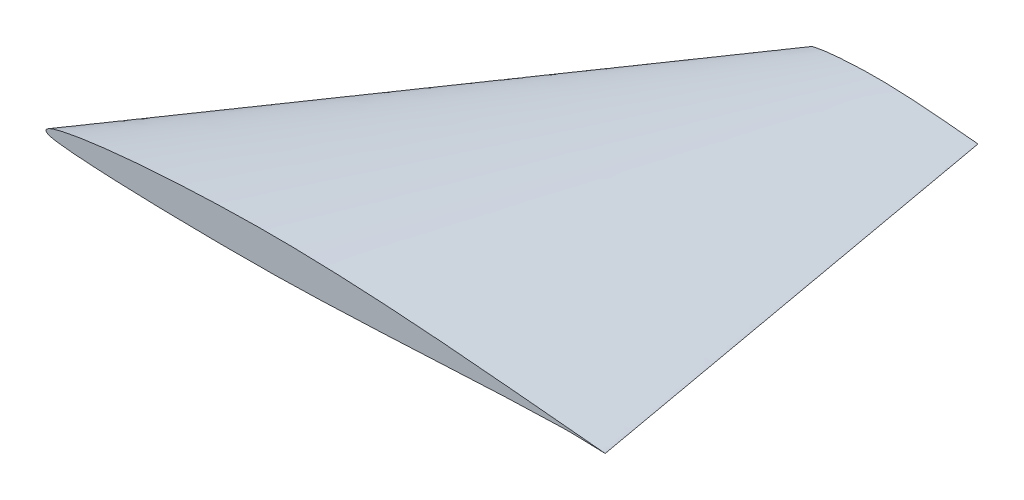
ISO-10303-21;
HEADER;
FILE_DESCRIPTION(('STEP AP214'),'2;1');
FILE_NAME('part.step','',(''),(''),'','','');
FILE_SCHEMA(('AUTOMOTIVE_DESIGN { 1 0 10303 214 1 1 1 1 }'));
ENDSEC;
DATA;
#1=APPLICATION_CONTEXT('core data for automotive mechanical design processes');
#2=APPLICATION_PROTOCOL_DEFINITION('international standard','automotive_design',2000,#1);
#3=PRODUCT_CONTEXT('',#1,'mechanical');
#4=PRODUCT('Part','Part','',(#3));
#5=PRODUCT_RELATED_PRODUCT_CATEGORY('part','',(#4));
#6=PRODUCT_DEFINITION_FORMATION('','',#4);
#7=PRODUCT_DEFINITION_CONTEXT('part definition',#1,'design');
#8=PRODUCT_DEFINITION('design','',#6,#7);
#9=PRODUCT_DEFINITION_SHAPE('','',#8);
#10=(LENGTH_UNIT() NAMED_UNIT(*) SI_UNIT(.MILLI.,.METRE.));
#11=(NAMED_UNIT(*) PLANE_ANGLE_UNIT() SI_UNIT($,.RADIAN.));
#12=(NAMED_UNIT(*) SI_UNIT($,.STERADIAN.) SOLID_ANGLE_UNIT());
#13=UNCERTAINTY_MEASURE_WITH_UNIT(LENGTH_MEASURE(1.E-05),#10,'distance_accuracy_value','');
#14=(GEOMETRIC_REPRESENTATION_CONTEXT(3) GLOBAL_UNCERTAINTY_ASSIGNED_CONTEXT((#13)) GLOBAL_UNIT_ASSIGNED_CONTEXT((#10,
#11,#12)) REPRESENTATION_CONTEXT('',''));
#15=CARTESIAN_POINT('',(0.,0.,0.));
#16=DIRECTION('',(0.,0.,1.));
#17=DIRECTION('',(1.,0.,0.));
#18=AXIS2_PLACEMENT_3D('',#15,#16,#17);
#19=CARTESIAN_POINT('',(3.63336270594469,13.6773950384951,0.));
#20=DIRECTION('',(0.,0.,-1.));
#21=DIRECTION('',(-1.,0.,0.));
#22=AXIS2_PLACEMENT_3D('',#19,#20,#21);
#23=PLANE('',#22);
#24=CARTESIAN_POINT('',(7973.1108,0.,0.));
#25=CARTESIAN_POINT('',(7973.4448166001,3.46874014402135,0.));
#26=CARTESIAN_POINT('',(7513.35192526295,42.1095353200564,0.));
#27=CARTESIAN_POINT('',(7193.44215496458,73.6677397091142,0.));
#28=CARTESIAN_POINT('',(6774.32823659022,112.953255344962,0.));
#29=CARTESIAN_POINT('',(6381.57455021336,149.054003977954,0.));
#30=CARTESIAN_POINT('',(5981.54840265774,184.478412710469,0.));
#31=CARTESIAN_POINT('',(5583.1806313874,216.671439350574,0.));
#32=CARTESIAN_POINT('',(5184.16839394543,246.191775981778,0.));
#33=CARTESIAN_POINT('',(4785.14294080162,271.971704733381,0.));
#34=CARTESIAN_POINT('',(4385.93372186477,293.375186775475,0.));
#35=CARTESIAN_POINT('',(3986.62898989573,310.186712132831,0.));
#36=CARTESIAN_POINT('',(3587.22077108428,321.049488011114,0.));
#37=CARTESIAN_POINT('',(3187.72703045812,325.856143484214,0.));
#38=CARTESIAN_POINT('',(2788.21885567217,320.645314873363,0.));
#39=CARTESIAN_POINT('',(2388.74252319517,310.365023761055,0.));
#40=CARTESIAN_POINT('',(1989.27135752529,293.539444554607,0.));
#41=CARTESIAN_POINT('',(1589.89553977371,269.670591450077,0.));
#42=CARTESIAN_POINT('',(1190.53675779631,238.430529670785,0.));
#43=CARTESIAN_POINT('',(858.032623246036,204.092940106485,0.));
#44=CARTESIAN_POINT('',(592.257617323616,169.402226480061,0.));
#45=CARTESIAN_POINT('',(392.778817261241,138.475561135967,0.));
#46=CARTESIAN_POINT('',(226.558327033441,105.06444026062,0.));
#47=CARTESIAN_POINT('',(114.526592139015,76.5641078591145,0.));
#48=CARTESIAN_POINT('',(61.8452525418591,55.7366630871479,0.));
#49=CARTESIAN_POINT('',(27.0243115347872,39.6533792528604,0.));
#50=CARTESIAN_POINT('',(-21.839097958613,-1.93112464848451,0.));
#51=CARTESIAN_POINT('',(33.3182814596933,-32.9810750225126,0.));
#52=CARTESIAN_POINT('',(69.4086652408865,-43.6825774278135,0.));
#53=CARTESIAN_POINT('',(123.603744942539,-56.5528772402976,0.));
#54=CARTESIAN_POINT('',(236.673192392193,-71.2511390940187,0.));
#55=CARTESIAN_POINT('',(403.659549417035,-87.6018865906431,0.));
#56=CARTESIAN_POINT('',(603.216509319253,-101.416050326465,0.));
#57=CARTESIAN_POINT('',(868.917329235554,-116.541219352788,0.));
#58=CARTESIAN_POINT('',(1200.84742357304,-130.223413671875,0.));
#59=CARTESIAN_POINT('',(1599.03883673265,-142.166839011258,0.));
#60=CARTESIAN_POINT('',(1997.07668183721,-150.2218451372,0.));
#61=CARTESIAN_POINT('',(2395.00450857896,-154.872807674681,0.));
#62=CARTESIAN_POINT('',(2792.90039356478,-155.963158331207,0.));
#63=CARTESIAN_POINT('',(3190.7984761954,-154.606723582166,0.));
#64=CARTESIAN_POINT('',(3588.69644740511,-146.022296253635,0.));
#65=CARTESIAN_POINT('',(3986.63818336044,-133.867597802096,0.));
#66=CARTESIAN_POINT('',(4384.6437589319,-118.35025163061,0.));
#67=CARTESIAN_POINT('',(4782.76624605711,-100.721138210546,0.));
#68=CARTESIAN_POINT('',(5180.98251706343,-81.5014025774358,0.));
#69=CARTESIAN_POINT('',(5579.45164455538,-61.1986948156736,0.));
#70=CARTESIAN_POINT('',(5977.58472764446,-41.0889165997257,0.));
#71=CARTESIAN_POINT('',(6377.78458372882,-21.7450095880476,0.));
#72=CARTESIAN_POINT('',(6771.07982958238,-3.94920269302418,0.));
#73=CARTESIAN_POINT('',(7191.07495840618,6.92113723208039,0.));
#74=CARTESIAN_POINT('',(7512.39898559307,21.2387947937664,0.));
#75=CARTESIAN_POINT('',(7972.77717169572,-3.46470771772588,0.));
#76=CARTESIAN_POINT('',(7973.1108,0.,0.));
#77=B_SPLINE_CURVE_WITH_KNOTS('',3,(#24,#25,#26,#27,#28,#29,#30,#31,#32,#33,#34,#35,#36,#37,#38,
#39,#40,#41,#42,#43,#44,#45,#46,#47,#48,#49,#50,#51,#52,#53,#54,#55,#56,#57,#58,#59,#60,#61,#62,
#63,#64,#65,#66,#67,#68,#69,#70,#71,#72,#73,#74,#75,#76),.UNSPECIFIED.,.T.,.F.,(4,1,1,1,1,1,1,1,
1,1,1,1,1,1,1,1,1,1,1,1,1,1,1,1,1,1,1,1,1,1,1,1,1,1,1,1,1,1,1,1,1,1,1,1,1,1,1,1,1,1,4),(0.,
0.0249563216438452,0.0499048911093339,0.0748697174485318,0.0998339759735948,0.124804651794424,
0.149775975466089,0.17473807802202,0.199694365081523,0.224644779849108,0.249585991084216,
0.274519879090468,0.299450900512802,0.324382082920327,0.349320412879847,0.374267429508116,
0.399236795566711,0.424224779613456,0.449261788021346,0.461813939794314,0.474399166054982,
0.487067083801195,0.493486614265045,0.496129330417317,0.497491232567908,0.501025389838791,
0.504501623345962,0.505834490100924,0.50842332671288,0.514754852870914,0.527287060327391,
0.539769148741578,0.552224474644191,0.577107285743186,0.601968705923853,0.626809027310946,
0.651645839739299,0.676476126974173,0.701306648462811,0.72614179351435,0.750988443635524,
0.775846921158433,0.800716114484763,0.825599827674277,0.850496417313331,0.875397726516232,
0.900311499999499,0.925233659143162,0.950150864559558,0.975072690194303,1.),.UNSPECIFIED.);
#78=CARTESIAN_POINT('',(7973.1108,0.,0.));
#79=VERTEX_POINT('',#78);
#80=EDGE_CURVE('E11',#79,#79,#77,.T.);
#81=ORIENTED_EDGE('',*,*,#80,.T.);
#82=EDGE_LOOP('',(#81));
#83=FACE_BOUND('',#82,.T.);
#84=ADVANCED_FACE('F53',(#83),#23,.F.);
#85=CARTESIAN_POINT('',(4417.89607301044,4.10345159362259,-6480.44424));
#86=DIRECTION('',(0.,0.,-1.));
#87=DIRECTION('',(-1.,0.,0.));
#88=AXIS2_PLACEMENT_3D('',#85,#86,#87);
#89=PLANE('',#88);
#90=CARTESIAN_POINT('',(6808.8764,0.,-6480.44424));
#91=CARTESIAN_POINT('',(6808.97661259504,1.04067801908643,-6480.44424));
#92=CARTESIAN_POINT('',(6670.94082224861,12.6335771494452,-6480.44424));
#93=CARTESIAN_POINT('',(6574.96238666733,22.1015686514406,-6480.44424));
#94=CARTESIAN_POINT('',(6449.22100585641,33.887938822516,-6480.44424));
#95=CARTESIAN_POINT('',(6331.38814673454,44.7187800811825,-6480.44424));
#96=CARTESIAN_POINT('',(6211.37341659721,55.3466835585677,-6480.44424));
#97=CARTESIAN_POINT('',(6091.8562338637,65.0051605977607,-6480.44424));
#98=CARTESIAN_POINT('',(5972.14569391376,73.861766136852,-6480.44424));
#99=CARTESIAN_POINT('',(5852.43119754835,81.5962095537961,-6480.44424));
#100=CARTESIAN_POINT('',(5732.66156381248,88.0176003571512,-6480.44424));
#101=CARTESIAN_POINT('',(5612.86327557455,93.0613289171664,-6480.44424));
#102=CARTESIAN_POINT('',(5493.03394310947,96.3203928492312,-6480.44424));
#103=CARTESIAN_POINT('',(5373.17894919158,97.7624424316363,-6480.44424));
#104=CARTESIAN_POINT('',(5253.31962371417,96.1991021261672,-6480.44424));
#105=CARTESIAN_POINT('',(5133.46985330829,93.114840953922,-6480.44424));
#106=CARTESIAN_POINT('',(5013.62163215555,88.0668895363902,-6480.44424));
#107=CARTESIAN_POINT('',(4893.80201734064,80.9058210029668,-6480.44424));
#108=CARTESIAN_POINT('',(4773.98750634705,71.5332626055982,-6480.44424));
#109=CARTESIAN_POINT('',(4674.2305421954,61.2313743350323,-6480.44424));
#110=CARTESIAN_POINT('',(4594.49346805573,50.8235789194601,-6480.44424));
#111=CARTESIAN_POINT('',(4534.64639725993,41.5450354941425,-6480.44424));
#112=CARTESIAN_POINT('',(4484.77738639665,31.5211417528946,-6480.44424));
#113=CARTESIAN_POINT('',(4451.16594253976,22.9705495896221,-6480.44424));
#114=CARTESIAN_POINT('',(4435.36063190756,16.7219746481048,-6480.44424));
#115=CARTESIAN_POINT('',(4424.91376773553,11.8966853792995,-6480.44424));
#116=CARTESIAN_POINT('',(4410.25389331106,-0.579361209114428,-6480.44424));
#117=CARTESIAN_POINT('',(4426.80205354984,-9.8948965914022,-6480.44424));
#118=CARTESIAN_POINT('',(4437.62979668603,-13.1055202707483,-6480.44424));
#119=CARTESIAN_POINT('',(4453.88925864946,-16.9668272002865,-6480.44424));
#120=CARTESIAN_POINT('',(4487.81203756447,-21.376552652583,-6480.44424));
#121=CARTESIAN_POINT('',(4537.91081566489,-26.2820698919096,-6480.44424));
#122=CARTESIAN_POINT('',(4597.78133441162,-30.426563138764,-6480.44424));
#123=CARTESIAN_POINT('',(4677.4961527331,-34.9643895676749,-6480.44424));
#124=CARTESIAN_POINT('',(4777.08088655997,-39.0692526391079,-6480.44424));
#125=CARTESIAN_POINT('',(4896.54515400179,-42.652503632106,-6480.44424));
#126=CARTESIAN_POINT('',(5015.96335583811,-45.069147693665,-6480.44424));
#127=CARTESIAN_POINT('',(5135.34855032828,-46.464513623207,-6480.44424));
#128=CARTESIAN_POINT('',(5254.72416218198,-46.7916391231494,-6480.44424));
#129=CARTESIAN_POINT('',(5374.10043125535,-46.3846726394692,-6480.44424));
#130=CARTESIAN_POINT('',(5493.4766686657,-43.8091936641694,-6480.44424));
#131=CARTESIAN_POINT('',(5612.86603907555,-40.1626015544209,-6480.44424));
#132=CARTESIAN_POINT('',(5732.27455816338,-35.5071037541425,-6480.44424));
#133=CARTESIAN_POINT('',(5851.7181553533,-30.2180973557122,-6480.44424));
#134=CARTESIAN_POINT('',(5971.18988781491,-24.4518088124811,-6480.44424));
#135=CARTESIAN_POINT('',(6090.73747874756,-18.3606810972272,-6480.44424));
#136=CARTESIAN_POINT('',(6210.18425183389,-12.3273832710142,-6480.44424));
#137=CARTESIAN_POINT('',(6330.25109098092,-6.52387731632277,-6480.44424));
#138=CARTESIAN_POINT('',(6448.24643489169,-1.18484085077497,-6480.44424));
#139=CARTESIAN_POINT('',(6574.25220023771,2.07644174338328,-6480.44424));
#140=CARTESIAN_POINT('',(6670.65493604578,6.37201684719386,-6480.44424));
#141=CARTESIAN_POINT('',(6808.77630391349,-1.03946811259236,-6480.44424));
#142=CARTESIAN_POINT('',(6808.8764,0.,-6480.44424));
#143=B_SPLINE_CURVE_WITH_KNOTS('',3,(#90,#91,#92,#93,#94,#95,#96,#97,#98,#99,#100,#101,#102,
#103,#104,#105,#106,#107,#108,#109,#110,#111,#112,#113,#114,#115,#116,#117,#118,#119,#120,#121,
#122,#123,#124,#125,#126,#127,#128,#129,#130,#131,#132,#133,#134,#135,#136,#137,#138,#139,#140,
#141,#142),.UNSPECIFIED.,.T.,.F.,(4,1,1,1,1,1,1,1,1,1,1,1,1,1,1,1,1,1,1,1,1,1,1,1,1,1,1,1,1,1,1,
1,1,1,1,1,1,1,1,1,1,1,1,1,1,1,1,1,1,1,4),(0.,0.0249563229354852,0.0499048925109715,
0.0748697180953834,0.0998339766889383,0.124804650888372,0.149775977248968,0.174738078473658,
0.199694366885427,0.224644780024467,0.249585991017604,0.274519880276674,0.299450898817867,
0.324382082083749,0.349320414454885,0.374267426855883,0.399236794042932,0.424224780706047,
0.449261789248352,0.461813942195485,0.474399165901735,0.487067086048325,0.493486616323249,
0.496129329689899,0.497491231722996,0.501025389853601,0.504501622592063,0.505834490296906,
0.508423329190248,0.514754855011337,0.527287059842358,0.539769150993382,0.552224475682113,
0.577107286739591,0.601968704445382,0.626809024722456,0.65164584130129,0.676476126104316,
0.701306646757171,0.726141794661069,0.750988443570079,0.775846921329097,0.800716116034225,
0.825599828146557,0.850496419032737,0.875397725704265,0.900311500507441,0.925233659488561,
0.950150866114027,0.975072691626785,1.),.UNSPECIFIED.);
#144=CARTESIAN_POINT('',(6808.8764,0.,-6480.44424));
#145=VERTEX_POINT('',#144);
#146=EDGE_CURVE('E63',#145,#145,#143,.T.);
#147=ORIENTED_EDGE('',*,*,#146,.F.);
#148=EDGE_LOOP('',(#147));
#149=FACE_BOUND('',#148,.T.);
#150=ADVANCED_FACE('F91',(#149),#89,.T.);
#151=CARTESIAN_POINT('',(4420.17383560183,7.07125244516924,-6480.44424));
#152=CARTESIAN_POINT('',(7.93028430782915,19.8224335317907,0.));
#153=CARTESIAN_POINT('',(4418.36439827989,5.15556901606775,-6480.44424));
#154=CARTESIAN_POINT('',(2.61815780987102,13.291000291928,0.));
#155=CARTESIAN_POINT('',(4416.80610988591,2.70994540558077,-6480.44424));
#156=CARTESIAN_POINT('',(-1.28418822538203,5.12700665326727,0.));
#157=CARTESIAN_POINT('',(4416.69999825229,-3.82629431781488,-6480.44424));
#158=CARTESIAN_POINT('',(3.4243057241674,-16.1527471929563,0.));
#159=CARTESIAN_POINT('',(4423.58867641043,-8.0859747531521,-6480.44424));
#160=CARTESIAN_POINT('',(27.915289008477,-29.647380323746,0.));
#161=CARTESIAN_POINT('',(4430.9987603325,-11.0881608268207,-6480.44424));
#162=CARTESIAN_POINT('',(51.6782265213138,-38.425156676765,0.));
#163=CARTESIAN_POINT('',(4433.42029917876,-11.8573273458712,-6480.44424));
#164=CARTESIAN_POINT('',(59.6302169252664,-40.7460451320899,0.));
#165=CARTESIAN_POINT('',(4438.85812584063,-13.3790210996881,-6480.44424));
#166=CARTESIAN_POINT('',(77.9720777587513,-45.716224894145,0.));
#167=CARTESIAN_POINT('',(4443.39326581266,-14.474232429052,-6480.44424));
#168=CARTESIAN_POINT('',(93.1727431535467,-49.2736233171186,0.));
#169=CARTESIAN_POINT('',(4457.07353552875,-17.3444306885409,-6480.44424));
#170=CARTESIAN_POINT('',(138.762691274246,-58.5234375254635,0.));
#171=CARTESIAN_POINT('',(4467.54072364474,-18.7414227545494,-6480.44424));
#172=CARTESIAN_POINT('',(173.653822875033,-63.0418250844767,0.));
#173=CARTESIAN_POINT('',(4497.01655656626,-22.2679291039489,-6480.44424));
#174=CARTESIAN_POINT('',(271.932963120416,-74.7036583191688,0.));
#175=CARTESIAN_POINT('',(4517.50207936991,-24.2837096219793,-6480.44424));
#176=CARTESIAN_POINT('',(340.224960710024,-81.3680869469672,0.));
#177=CARTESIAN_POINT('',(4557.01725398642,-27.5979745899655,-6480.44424));
#178=CARTESIAN_POINT('',(471.933866639532,-92.3281191285871,0.));
#179=CARTESIAN_POINT('',(4577.42070698438,-29.0171134690373,-6480.44424));
#180=CARTESIAN_POINT('',(539.942355141276,-97.0263021275176,0.));
#181=CARTESIAN_POINT('',(4616.83437012692,-31.5082871923772,-6480.44424));
#182=CARTESIAN_POINT('',(671.317879081516,-105.292759208669,0.));
#183=CARTESIAN_POINT('',(4637.22280505009,-32.6717987377035,-6480.44424));
#184=CARTESIAN_POINT('',(739.276840472655,-109.153144938619,0.));
#185=CARTESIAN_POINT('',(4696.51814880183,-35.7436061958496,-6480.44424));
#186=CARTESIAN_POINT('',(936.918559333302,-119.344237397872,0.));
#187=CARTESIAN_POINT('',(4736.81654654416,-37.4095644913856,-6480.44424));
#188=CARTESIAN_POINT('',(1071.2398231133,-124.872263231976,0.));
#189=CARTESIAN_POINT('',(4816.01630719485,-40.2344845596166,-6480.44424));
#190=CARTESIAN_POINT('',(1335.22517602797,-134.253964308275,0.));
#191=CARTESIAN_POINT('',(4856.29757959374,-41.445304491713,-6480.44424));
#192=CARTESIAN_POINT('',(1469.48889302321,-138.27352116322,0.));
#193=CARTESIAN_POINT('',(4935.45526403229,-43.4376506179564,-6480.44424));
#194=CARTESIAN_POINT('',(1733.33341745888,-144.884529511634,0.));
#195=CARTESIAN_POINT('',(4975.7120905696,-44.2545902837761,-6480.44424));
#196=CARTESIAN_POINT('',(1867.51543380269,-147.59330814356,0.));
#197=CARTESIAN_POINT('',(5054.84513441636,-45.5216054763028,-6480.44424));
#198=CARTESIAN_POINT('',(2131.27755285399,-151.790378880384,0.));
#199=CARTESIAN_POINT('',(5095.10205561716,-45.9941153653391,-6480.44424));
#200=CARTESIAN_POINT('',(2265.45974524175,-153.351750121147,0.));
#201=CARTESIAN_POINT('',(5174.226684134,-46.5689688081779,-6480.44424));
#202=CARTESIAN_POINT('',(2529.19354012102,-155.240524718665,0.));
#203=CARTESIAN_POINT('',(5214.475230176,-46.6813448025579,-6480.44424));
#204=CARTESIAN_POINT('',(2663.34772891232,-155.603374316227,0.));
#205=CARTESIAN_POINT('',(5293.59291382269,-46.6576997296494,-6480.44424));
#206=CARTESIAN_POINT('',(2927.05830432746,-155.505813950922,0.));
#207=CARTESIAN_POINT('',(5333.84296248403,-46.5219146611449,-6480.44424));
#208=CARTESIAN_POINT('',(3061.21729120889,-155.034373640058,0.));
#209=CARTESIAN_POINT('',(5412.96095331632,-45.5420478567857,-6480.44424));
#210=CARTESIAN_POINT('',(3324.92813481383,-151.712950830548,0.));
#211=CARTESIAN_POINT('',(5453.20962142053,-44.6779338408333,-6480.44424));
#212=CARTESIAN_POINT('',(3459.08229300041,-148.81169408225,0.));
#213=CARTESIAN_POINT('',(5532.33428745841,-42.6202503272424,-6480.44424));
#214=CARTESIAN_POINT('',(3722.81524724126,-141.925783067409,0.));
#215=CARTESIAN_POINT('',(5572.5907221039,-41.3927584149711,-6480.44424));
#216=CARTESIAN_POINT('',(3856.99523202786,-137.820855171698,0.));
#217=CARTESIAN_POINT('',(5651.73055668448,-38.645386762323,-6480.44424));
#218=CARTESIAN_POINT('',(4120.77865138056,-128.637761323337,0.));
#219=CARTESIAN_POINT('',(5691.99401171495,-37.0775611789328,-6480.44424));
#220=CARTESIAN_POINT('',(4254.98208639894,-123.401367520304,0.));
#221=CARTESIAN_POINT('',(5771.15013681876,-33.7844473844491,-6480.44424));
#222=CARTESIAN_POINT('',(4518.82008790245,-112.408839632534,0.));
#223=CARTESIAN_POINT('',(5811.42254832846,-32.0024016499318,-6480.44424));
#224=CARTESIAN_POINT('',(4653.05338999458,-106.461818064719,0.));
#225=CARTESIAN_POINT('',(5890.60017277219,-28.3405345387881,-6480.44424));
#226=CARTESIAN_POINT('',(4916.96283339485,-94.2441981172165,0.));
#227=CARTESIAN_POINT('',(5930.88475733448,-26.3971310015389,-6480.44424));
#228=CARTESIAN_POINT('',(5051.23702948917,-87.7614297279683,0.));
#229=CARTESIAN_POINT('',(6010.10321433183,-22.4684920477751,-6480.44424));
#230=CARTESIAN_POINT('',(5315.28403543076,-74.6585023594561,0.));
#231=CARTESIAN_POINT('',(6050.41654730955,-20.4150925752912,-6480.44424));
#232=CARTESIAN_POINT('',(5449.65329840115,-67.812492278116,0.));
#233=CARTESIAN_POINT('',(6129.62259875764,-16.3966828389736,-6480.44424));
#234=CARTESIAN_POINT('',(5713.65453483831,-54.4200811456186,0.));
#235=CARTESIAN_POINT('',(6169.89360531124,-14.3624777637397,-6480.44424));
#236=CARTESIAN_POINT('',(5847.88631372332,-47.6416996304062,0.));
#237=CARTESIAN_POINT('',(6249.26685359892,-10.4388064688827,-6480.44424));
#238=CARTESIAN_POINT('',(6112.46339276828,-34.5694730858219,0.));
#239=CARTESIAN_POINT('',(6289.75167346572,-8.4814420559358,-6480.44424));
#240=CARTESIAN_POINT('',(6247.3952258787,-28.0498193846383,0.));
#241=CARTESIAN_POINT('',(6368.66573292458,-4.78641789239816,-6480.44424));
#242=CARTESIAN_POINT('',(6510.37359767323,-15.7456274103265,0.));
#243=CARTESIAN_POINT('',(6408.46203074623,-2.9849998863155,-6480.44424));
#244=CARTESIAN_POINT('',(6643.05853847143,-9.75771227361637,0.));
#245=CARTESIAN_POINT('',(6489.29855970544,-0.126769959417209,-6480.44424));
#246=CARTESIAN_POINT('',(6912.70185600819,-0.283732637592584,0.));
#247=CARTESIAN_POINT('',(6531.76371627647,0.976754337696364,-6480.44424));
#248=CARTESIAN_POINT('',(7054.10428725401,3.38771395298588,0.));
#249=CARTESIAN_POINT('',(6605.5818034512,3.47702007597454,-6480.44424));
#250=CARTESIAN_POINT('',(7299.39641838228,11.7477590819852,0.));
#251=CARTESIAN_POINT('',(6638.14360801516,4.92335618305882,-6480.44424));
#252=CARTESIAN_POINT('',(7408.45502570183,16.4754574251987,0.));
#253=CARTESIAN_POINT('',(6738.33142069466,2.72214869202247,-6480.44424));
#254=CARTESIAN_POINT('',(7745.21569018067,8.74604813436101,0.));
#255=CARTESIAN_POINT('',(6807.98038150238,-0.996759536285641,-6480.44424));
#256=CARTESIAN_POINT('',(7975.40341165155,-3.56503428176925,0.));
#257=CARTESIAN_POINT('',(6809.7608409296,0.962600367256277,-6480.44424));
#258=CARTESIAN_POINT('',(7970.79650007347,3.69115839562621,0.));
#259=CARTESIAN_POINT('',(6740.74253872685,6.77129856048406,-6480.44424));
#260=CARTESIAN_POINT('',(7738.78473448091,23.185716303742,0.));
#261=CARTESIAN_POINT('',(6639.90039109685,15.7015158412508,-6480.44424));
#262=CARTESIAN_POINT('',(7405.48899390306,52.7499119196321,0.));
#263=CARTESIAN_POINT('',(6607.33402340401,18.9082015198309,-6480.44424));
#264=CARTESIAN_POINT('',(7297.46683325596,63.4020025496827,0.));
#265=CARTESIAN_POINT('',(6533.97350122126,25.9427473061318,-6480.44424));
#266=CARTESIAN_POINT('',(7052.18925481947,86.9080373322131,0.));
#267=CARTESIAN_POINT('',(6491.62564995592,29.9131388870747,-6480.44424));
#268=CARTESIAN_POINT('',(6910.89673477292,100.150663971241,0.));
#269=CARTESIAN_POINT('',(6410.8653928814,37.413027625956,-6480.44424));
#270=CARTESIAN_POINT('',(6641.91328402439,125.124443251374,0.));
#271=CARTESIAN_POINT('',(6371.1241105442,41.0663700532005,-6480.44424));
#272=CARTESIAN_POINT('',(6509.4872715267,137.294039847834,0.));
#273=CARTESIAN_POINT('',(6292.30670406919,48.1788684298421,-6480.44424));
#274=CARTESIAN_POINT('',(6246.72245376767,160.99586280923,0.));
#275=CARTESIAN_POINT('',(6251.84268768173,51.7629275779955,-6480.44424));
#276=CARTESIAN_POINT('',(6111.83928945833,172.934490358837,0.));
#277=CARTESIAN_POINT('',(6172.44779201696,58.4905566308655,-6480.44424));
#278=CARTESIAN_POINT('',(5847.21737216612,195.334015886948,0.));
#279=CARTESIAN_POINT('',(6132.1441760957,61.7493930494935,-6480.44424));
#280=CARTESIAN_POINT('',(5712.88148294799,206.184724925323,0.));
#281=CARTESIAN_POINT('',(6052.85772530027,67.888824292858,-6480.44424));
#282=CARTESIAN_POINT('',(5448.60296739968,226.627970933233,0.));
#283=CARTESIAN_POINT('',(6012.49727245346,70.8764148540385,-6480.44424));
#284=CARTESIAN_POINT('',(5314.07419874328,236.57362414849,0.));
#285=CARTESIAN_POINT('',(5933.15010066027,76.378993205361,-6480.44424));
#286=CARTESIAN_POINT('',(5049.5978398582,254.886006560553,0.));
#287=CARTESIAN_POINT('',(5892.78598920234,78.9889910286675,-6480.44424));
#288=CARTESIAN_POINT('',(4915.05770031737,263.569753345291,0.));
#289=CARTESIAN_POINT('',(5813.41595698633,83.6854393638605,-6480.44424));
#290=CARTESIAN_POINT('',(4650.50384418938,279.190339348529,0.));
#291=CARTESIAN_POINT('',(5773.03148250157,85.8531867531655,-6480.44424));
#292=CARTESIAN_POINT('',(4515.89565926417,286.398389264789,0.));
#293=CARTESIAN_POINT('',(5693.63475715275,89.6580248667312,-6480.44424));
#294=CARTESIAN_POINT('',(4251.25344422612,299.045494992192,0.));
#295=CARTESIAN_POINT('',(5653.24321759494,91.3612589928323,-6480.44424));
#296=CARTESIAN_POINT('',(4116.62188029499,304.702188976889,0.));
#297=CARTESIAN_POINT('',(5573.83098161282,94.1194453048906,-6480.44424));
#298=CARTESIAN_POINT('',(3851.92802404714,313.850198094526,0.));
#299=CARTESIAN_POINT('',(5533.43022440265,95.2217130798975,-6480.44424));
#300=CARTESIAN_POINT('',(3717.26588188559,317.50085970552,0.));
#301=CARTESIAN_POINT('',(5453.99982578723,96.7865072312641,-6480.44424));
#302=CARTESIAN_POINT('',(3452.5120054516,322.670285935477,0.));
#303=CARTESIAN_POINT('',(5413.58955768018,97.2762374001159,-6480.44424));
#304=CARTESIAN_POINT('',(3317.81858397672,324.271442295276,0.));
#305=CARTESIAN_POINT('',(5334.15042307591,97.2475509440146,-6480.44424));
#306=CARTESIAN_POINT('',(3053.03672323336,324.099363145821,0.));
#307=CARTESIAN_POINT('',(5293.74074918798,96.7263199658634,-6480.44424));
#308=CARTESIAN_POINT('',(2918.34577929656,322.332731040231,0.));
#309=CARTESIAN_POINT('',(5214.30235583101,95.1920614585296,-6480.44424));
#310=CARTESIAN_POINT('',(2653.56721309365,317.1801331544,0.));
#311=CARTESIAN_POINT('',(5173.89302467389,94.1551067590189,-6480.44424));
#312=CARTESIAN_POINT('',(2518.8777995615,313.70127798268,0.));
#313=CARTESIAN_POINT('',(5094.46159678265,91.4680173888292,-6480.44424));
#314=CARTESIAN_POINT('',(2254.12315094073,304.694905101073,0.));
#315=CARTESIAN_POINT('',(5054.05944608972,89.770111480008,-6480.44424));
#316=CARTESIAN_POINT('',(2119.4581423714,299.009201683592,0.));
#317=CARTESIAN_POINT('',(4974.63473723652,85.7327154135249,-6480.44424));
#318=CARTESIAN_POINT('',(1854.72704166994,285.498350506197,0.));
#319=CARTESIAN_POINT('',(4934.23316548519,83.3222051917772,-6480.44424));
#320=CARTESIAN_POINT('',(1720.06451903615,277.43591568936,0.));
#321=CARTESIAN_POINT('',(4854.82793718946,77.8527597547031,-6480.44424));
#322=CARTESIAN_POINT('',(1455.39938588506,259.149555363793,0.));
#323=CARTESIAN_POINT('',(4814.4467392471,74.6982091544241,-6480.44424));
#324=CARTESIAN_POINT('',(1320.80576854361,248.601581674566,0.));
#325=CARTESIAN_POINT('',(4735.06943012887,67.5083796397729,-6480.44424));
#326=CARTESIAN_POINT('',(1056.23657637906,224.561395339105,0.));
#327=CARTESIAN_POINT('',(4694.69840483861,63.3450877572568,-6480.44424));
#328=CARTESIAN_POINT('',(921.679092677963,210.63774778738,0.));
#329=CARTESIAN_POINT('',(4635.35525888891,56.1528591321153,-6480.44424));
#330=CARTESIAN_POINT('',(723.889347361827,186.583671496148,0.));
#331=CARTESIAN_POINT('',(4614.95039981978,53.4937491373642,-6480.44424));
#332=CARTESIAN_POINT('',(655.881684402081,177.687885439418,0.));
#333=CARTESIAN_POINT('',(4575.53336199723,47.8783205138966,-6480.44424));
#334=CARTESIAN_POINT('',(524.510761564575,158.898933220229,0.));
#335=CARTESIAN_POINT('',(4555.15487982702,44.7246204521993,-6480.44424));
#336=CARTESIAN_POINT('',(456.593561751685,148.333906391843,0.));
#337=CARTESIAN_POINT('',(4515.73664124929,37.7333667013881,-6480.44424));
#338=CARTESIAN_POINT('',(325.223104236957,124.896536729402,0.));
#339=CARTESIAN_POINT('',(4495.33730484829,33.6437324889671,-6480.44424));
#340=CARTESIAN_POINT('',(257.251439544407,111.180237510241,0.));
#341=CARTESIAN_POINT('',(4466.0745371609,26.754740509742,-6480.44424));
#342=CARTESIAN_POINT('',(159.766806385381,88.0729999168141,0.));
#343=CARTESIAN_POINT('',(4455.69791638015,24.1234622752188,-6480.44424));
#344=CARTESIAN_POINT('',(125.211029393021,79.1307378293866,0.));
#345=CARTESIAN_POINT('',(4442.3064373533,19.4477265992298,-6480.44424));
#346=CARTESIAN_POINT('',(80.6319735102565,63.1639494167607,0.));
#347=CARTESIAN_POINT('',(4437.86111753797,17.7105330013939,-6480.44424));
#348=CARTESIAN_POINT('',(65.9159484900053,57.2814110071214,0.));
#349=CARTESIAN_POINT('',(4432.51004827902,15.3933869467579,-6480.44424));
#350=CARTESIAN_POINT('',(48.3119773272346,49.4858410188951,0.));
#351=CARTESIAN_POINT('',(4430.20929413973,14.3426295698322,-6480.44424));
#352=CARTESIAN_POINT('',(40.5768769892781,45.6933564925733,0.));
#353=CARTESIAN_POINT('',(4425.6319779397,11.7614182509123,-6480.44424));
#354=CARTESIAN_POINT('',(24.8739645229907,36.0516514097888,0.));
#355=CARTESIAN_POINT('',(4422.3171628667,9.34043108686097,-6480.44424));
#356=CARTESIAN_POINT('',(14.2226412849863,27.5590922001196,0.));
#357=CARTESIAN_POINT('',(4420.17383560183,7.07125244516924,-6480.44424));
#358=CARTESIAN_POINT('',(7.93028430782915,19.8224335317907,0.));
#359=B_SPLINE_SURFACE_WITH_KNOTS('',3,1,((#151,#152),(#153,#154),(#155,#156),(#157,#158),(#159,
#160),(#161,#162),(#163,#164),(#165,#166),(#167,#168),(#169,#170),(#171,#172),(#173,#174),(#175,
#176),(#177,#178),(#179,#180),(#181,#182),(#183,#184),(#185,#186),(#187,#188),(#189,#190),(#191,
#192),(#193,#194),(#195,#196),(#197,#198),(#199,#200),(#201,#202),(#203,#204),(#205,#206),(#207,
#208),(#209,#210),(#211,#212),(#213,#214),(#215,#216),(#217,#218),(#219,#220),(#221,#222),(#223,
#224),(#225,#226),(#227,#228),(#229,#230),(#231,#232),(#233,#234),(#235,#236),(#237,#238),(#239,
#240),(#241,#242),(#243,#244),(#245,#246),(#247,#248),(#249,#250),(#251,#252),(#253,#254),(#255,
#256),(#257,#258),(#259,#260),(#261,#262),(#263,#264),(#265,#266),(#267,#268),(#269,#270),(#271,
#272),(#273,#274),(#275,#276),(#277,#278),(#279,#280),(#281,#282),(#283,#284),(#285,#286),(#287,
#288),(#289,#290),(#291,#292),(#293,#294),(#295,#296),(#297,#298),(#299,#300),(#301,#302),(#303,
#304),(#305,#306),(#307,#308),(#309,#310),(#311,#312),(#313,#314),(#315,#316),(#317,#318),(#319,
#320),(#321,#322),(#323,#324),(#325,#326),(#327,#328),(#329,#330),(#331,#332),(#333,#334),(#335,
#336),(#337,#338),(#339,#340),(#341,#342),(#343,#344),(#345,#346),(#347,#348),(#349,#350),(#351,
#352),(#353,#354),(#355,#356),(#357,#358)),.UNSPECIFIED.,.T.,.F.,.F.,(4,1,1,1,1,1,1,1,1,1,1,1,1,
1,1,1,1,1,1,1,1,1,1,1,1,1,1,1,1,1,1,1,1,1,1,1,1,1,1,1,1,1,1,1,1,1,1,1,1,1,1,1,1,1,1,1,1,1,1,1,1,
1,1,1,1,1,1,1,1,1,1,1,1,1,1,1,1,1,1,1,1,1,1,1,1,1,1,1,1,1,1,1,1,1,1,1,1,1,1,1,1,4),(2,2),(0.,
0.00148631867380572,0.00177357361120556,0.00496255218097758,0.00524980634966687,
0.00629541893593938,0.00658267405451052,0.00888425554789524,0.00917151294785179,
0.0152157817059288,0.0155030387689409,0.0277479891624065,0.0280352435999625,0.0402300775765931,
0.0405173347509866,0.052685403479206,0.0529726594397174,0.0775682145782012,0.0778554704971953,
0.102429634758868,0.102716888202986,0.127269956145961,0.12755720848006,0.152106768574315,
0.152394025058894,0.176937055809189,0.177224309861921,0.201767577297826,0.202054830514775,
0.226602722349365,0.226889978418673,0.251449372470539,0.251736627327683,0.276307849993449,
0.276595105086701,0.301177043319779,0.301464299791829,0.326060756509293,0.326348011904161,
0.350957346148346,0.351244602790342,0.375858655351248,0.376145909461869,0.400772428834514,
0.401059684265046,0.425694587978177,0.425981843246166,0.450611793394573,0.450899049871631,
0.475533619029318,0.475820875384389,0.500460928835015,0.500748183757604,0.52541725047886,
0.525704506693089,0.550365819944349,0.550653076268576,0.575330646283547,0.575617901852988,
0.60029490480861,0.600582160446543,0.625265580629439,0.625552834645976,0.650236904301104,
0.650524161006572,0.675199006857035,0.675486262231262,0.700155293916538,0.700442550643031,
0.725105708684124,0.725392963782071,0.750046919919231,0.750334174775209,0.774980807925484,
0.775268064034278,0.799911829347817,0.800199082575471,0.824843011755342,0.825130265841354,
0.849781341714862,0.850068598212489,0.874728358343132,0.875015610613487,0.899697724401727,
0.899984977800536,0.924685708448471,0.924972964463651,0.949722716856361,0.950009973005956,
0.962274868629329,0.962562125953089,0.974860094889997,0.975147349659339,0.98752801263621,
0.987815269805929,0.99394754310006,0.994234800080853,0.996590259252333,0.996877513447503,
0.997952161402923,0.9982394154806,1.),(0.,1.),.UNSPECIFIED.);
#360=ORIENTED_EDGE('',*,*,#146,.T.);
#361=EDGE_LOOP('',(#360));
#362=FACE_BOUND('',#361,.T.);
#363=ORIENTED_EDGE('',*,*,#80,.F.);
#364=EDGE_LOOP('',(#363));
#365=FACE_BOUND('',#364,.T.);
#366=ADVANCED_FACE('F99',(#362,#365),#359,.T.);
#367=CLOSED_SHELL('',(#84,#150,#366));
#368=MANIFOLD_SOLID_BREP('B2',#367);
#369=ADVANCED_BREP_SHAPE_REPRESENTATION('',(#18,#368),#14);
#370=SHAPE_DEFINITION_REPRESENTATION(#9,#369);
ENDSEC;
END-ISO-10303-21;
